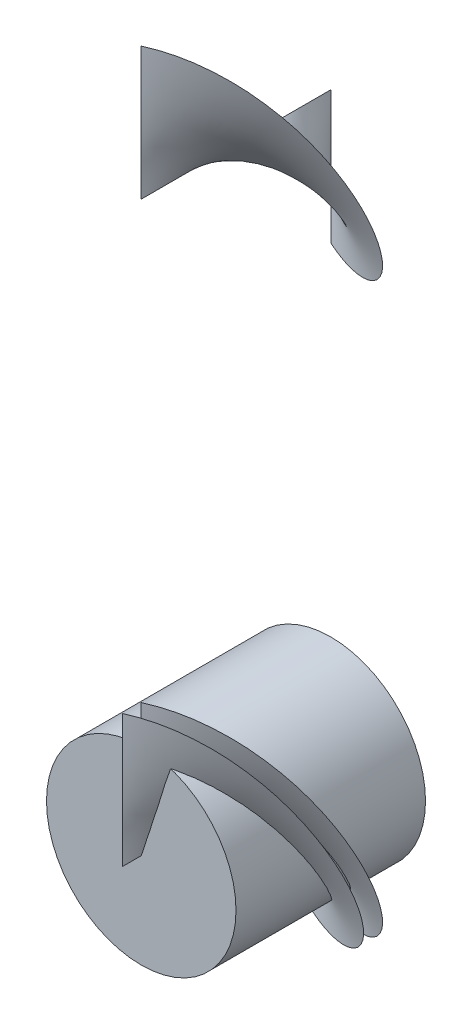
ISO-10303-21;
HEADER;
FILE_DESCRIPTION(('STEP AP214'),'2;1');
FILE_NAME('part.step','',(''),(''),'','','');
FILE_SCHEMA(('AUTOMOTIVE_DESIGN { 1 0 10303 214 1 1 1 1 }'));
ENDSEC;
DATA;
#1=APPLICATION_CONTEXT('core data for automotive mechanical design processes');
#2=APPLICATION_PROTOCOL_DEFINITION('international standard','automotive_design',2000,#1);
#3=PRODUCT_CONTEXT('',#1,'mechanical');
#4=PRODUCT('Part','Part','',(#3));
#5=PRODUCT_RELATED_PRODUCT_CATEGORY('part','',(#4));
#6=PRODUCT_DEFINITION_FORMATION('','',#4);
#7=PRODUCT_DEFINITION_CONTEXT('part definition',#1,'design');
#8=PRODUCT_DEFINITION('design','',#6,#7);
#9=PRODUCT_DEFINITION_SHAPE('','',#8);
#10=(LENGTH_UNIT() NAMED_UNIT(*) SI_UNIT(.MILLI.,.METRE.));
#11=(NAMED_UNIT(*) PLANE_ANGLE_UNIT() SI_UNIT($,.RADIAN.));
#12=(NAMED_UNIT(*) SI_UNIT($,.STERADIAN.) SOLID_ANGLE_UNIT());
#13=UNCERTAINTY_MEASURE_WITH_UNIT(LENGTH_MEASURE(1.E-05),#10,'distance_accuracy_value','');
#14=(GEOMETRIC_REPRESENTATION_CONTEXT(3) GLOBAL_UNCERTAINTY_ASSIGNED_CONTEXT((#13)) GLOBAL_UNIT_ASSIGNED_CONTEXT((#10,
#11,#12)) REPRESENTATION_CONTEXT('',''));
#15=CARTESIAN_POINT('',(0.,0.,0.));
#16=DIRECTION('',(0.,0.,1.));
#17=DIRECTION('',(1.,0.,0.));
#18=AXIS2_PLACEMENT_3D('',#15,#16,#17);
#19=CARTESIAN_POINT('',(0.,0.,10.));
#20=CARTESIAN_POINT('',(0.,0.,15.));
#21=CARTESIAN_POINT('',(0.,0.,20.));
#22=CARTESIAN_POINT('',(0.,0.,25.));
#23=CARTESIAN_POINT('',(0.,0.,30.));
#24=CARTESIAN_POINT('',(0.,0.,35.));
#25=CARTESIAN_POINT('',(0.,0.,39.9999999999999));
#26=CARTESIAN_POINT('',(0.,0.,44.9999999999999));
#27=CARTESIAN_POINT('',(0.,0.,49.9999999999999));
#28=CARTESIAN_POINT('',(0.,0.,54.9999999999999));
#29=CARTESIAN_POINT('',(0.,0.,59.9999999999999));
#30=CARTESIAN_POINT('',(0.,0.,64.9999999999999));
#31=CARTESIAN_POINT('',(0.,0.,69.9999999999999));
#32=CARTESIAN_POINT('',(0.,0.,74.9999999999998));
#33=CARTESIAN_POINT('',(0.,0.,79.9999999999998));
#34=CARTESIAN_POINT('',(0.,0.,84.9999999999998));
#35=CARTESIAN_POINT('',(0.,0.,89.9999999999998));
#36=CARTESIAN_POINT('',(0.,0.,94.9999999999998));
#37=CARTESIAN_POINT('',(0.,0.,99.9999999999998));
#38=CARTESIAN_POINT('',(0.,0.,105.));
#39=CARTESIAN_POINT('',(0.,0.,110.));
#40=CARTESIAN_POINT('',(-4.88807387438039E-13,-70.,10.));
#41=CARTESIAN_POINT('',(11.0869108227171,-70.0000000000001,15.));
#42=CARTESIAN_POINT('',(21.6311896062459,-66.5739561406609,20.));
#43=CARTESIAN_POINT('',(32.1754683897747,-63.1479122813217,25.));
#44=CARTESIAN_POINT('',(41.1449676604727,-56.6311896062466,30.));
#45=CARTESIAN_POINT('',(50.1144669311708,-50.1144669311715,35.));
#46=CARTESIAN_POINT('',(56.631189606246,-41.1449676604735,39.9999999999999));
#47=CARTESIAN_POINT('',(63.1479122813213,-32.1754683897755,44.9999999999999));
#48=CARTESIAN_POINT('',(66.5739561406606,-21.6311896062468,49.9999999999999));
#49=CARTESIAN_POINT('',(69.9999999999999,-11.086910822718,54.9999999999999));
#50=CARTESIAN_POINT('',(70.,-4.93093651235054E-13,59.9999999999999));
#51=CARTESIAN_POINT('',(70.0000000000001,11.086910822717,64.9999999999999));
#52=CARTESIAN_POINT('',(66.5739561406609,21.6311896062459,69.9999999999999));
#53=CARTESIAN_POINT('',(63.1479122813217,32.1754683897747,74.9999999999998));
#54=CARTESIAN_POINT('',(56.6311896062466,41.1449676604727,79.9999999999998));
#55=CARTESIAN_POINT('',(50.1144669311715,50.1144669311708,84.9999999999998));
#56=CARTESIAN_POINT('',(41.1449676604735,56.631189606246,89.9999999999998));
#57=CARTESIAN_POINT('',(32.1754683897756,63.1479122813213,94.9999999999998));
#58=CARTESIAN_POINT('',(21.6311896062468,66.5739561406606,99.9999999999998));
#59=CARTESIAN_POINT('',(11.086910822718,69.9999999999999,105.));
#60=CARTESIAN_POINT('',(4.9737991503207E-13,70.,110.));
#61=(BOUNDED_SURFACE() B_SPLINE_SURFACE(1,2,((#19,#20,#21,#22,#23,#24,#25,#26,#27,#28,#29,#30,
#31,#32,#33,#34,#35,#36,#37,#38,#39),(#40,#41,#42,#43,#44,#45,#46,#47,#48,#49,#50,#51,#52,#53,
#54,#55,#56,#57,#58,#59,#60)),.UNSPECIFIED.,.F.,.F.,.F.) B_SPLINE_SURFACE_WITH_KNOTS((2,2),(3,2,
2,2,2,2,2,2,2,2,3),(0.,1.),(0.,0.1,0.2,0.3,0.4,0.5,0.6,0.7,0.8,0.9,1.),
.UNSPECIFIED.) GEOMETRIC_REPRESENTATION_ITEM() RATIONAL_B_SPLINE_SURFACE(((1.,0.987688340595138,
1.,0.987688340595138,1.,0.987688340595138,1.,0.987688340595138,1.,0.987688340595138,1.,
0.987688340595138,1.,0.987688340595138,1.,0.987688340595138,1.,0.987688340595138,1.,
0.987688340595138,1.),(1.,0.987688340595138,1.,0.987688340595138,1.,0.987688340595138,1.,
0.987688340595138,1.,0.987688340595138,1.,0.987688340595138,1.,0.987688340595138,1.,
0.987688340595138,1.,0.987688340595138,1.,0.987688340595138,1.))) REPRESENTATION_ITEM('') SURFACE());
#62=CARTESIAN_POINT('',(-4.88807387438039E-13,-70.,10.));
#63=CARTESIAN_POINT('',(11.0869108227171,-70.0000000000001,15.));
#64=CARTESIAN_POINT('',(21.6311896062459,-66.5739561406609,20.));
#65=CARTESIAN_POINT('',(32.1754683897747,-63.1479122813217,25.));
#66=CARTESIAN_POINT('',(41.1449676604727,-56.6311896062466,30.));
#67=CARTESIAN_POINT('',(50.1144669311708,-50.1144669311715,35.));
#68=CARTESIAN_POINT('',(56.631189606246,-41.1449676604735,39.9999999999999));
#69=CARTESIAN_POINT('',(63.1479122813213,-32.1754683897755,44.9999999999999));
#70=CARTESIAN_POINT('',(66.5739561406606,-21.6311896062468,49.9999999999999));
#71=CARTESIAN_POINT('',(69.9999999999999,-11.086910822718,54.9999999999999));
#72=CARTESIAN_POINT('',(70.,-4.93093651235054E-13,59.9999999999999));
#73=CARTESIAN_POINT('',(70.0000000000001,11.086910822717,64.9999999999999));
#74=CARTESIAN_POINT('',(66.5739561406609,21.6311896062459,69.9999999999999));
#75=CARTESIAN_POINT('',(63.1479122813217,32.1754683897747,74.9999999999998));
#76=CARTESIAN_POINT('',(56.6311896062466,41.1449676604727,79.9999999999998));
#77=CARTESIAN_POINT('',(50.1144669311715,50.1144669311708,84.9999999999998));
#78=CARTESIAN_POINT('',(41.1449676604735,56.631189606246,89.9999999999998));
#79=CARTESIAN_POINT('',(32.1754683897756,63.1479122813213,94.9999999999998));
#80=CARTESIAN_POINT('',(21.6311896062468,66.5739561406606,99.9999999999998));
#81=CARTESIAN_POINT('',(11.086910822718,69.9999999999999,105.));
#82=CARTESIAN_POINT('',(4.9737991503207E-13,70.,110.));
#83=(BOUNDED_CURVE() B_SPLINE_CURVE(2,(#62,#63,#64,#65,#66,#67,#68,#69,#70,#71,#72,#73,#74,#75,
#76,#77,#78,#79,#80,#81,#82),.UNSPECIFIED.,.F.,.F.) B_SPLINE_CURVE_WITH_KNOTS((3,2,2,2,2,2,2,2,
2,2,3),(0.,0.1,0.2,0.3,0.4,0.5,0.6,0.7,0.8,0.9,1.),
.UNSPECIFIED.) CURVE() GEOMETRIC_REPRESENTATION_ITEM() RATIONAL_B_SPLINE_CURVE((1.,
0.987688340595138,1.,0.987688340595138,1.,0.987688340595138,1.,0.987688340595138,1.,
0.987688340595138,1.,0.987688340595138,1.,0.987688340595138,1.,0.987688340595138,1.,
0.987688340595138,1.,0.987688340595138,1.)) REPRESENTATION_ITEM(''));
#84=CARTESIAN_POINT('',(-4.88807387438039E-13,-70.,10.));
#85=VERTEX_POINT('',#84);
#86=CARTESIAN_POINT('',(4.9737991503207E-13,70.,110.));
#87=VERTEX_POINT('',#86);
#88=EDGE_CURVE('E12',#85,#87,#83,.T.);
#89=DIRECTION('',(0.,1.,0.));
#90=VECTOR('',#89,1.);
#91=CARTESIAN_POINT('',(0.,0.,110.));
#92=LINE('',#91,#90);
#93=CARTESIAN_POINT('',(0.,0.,110.));
#94=VERTEX_POINT('',#93);
#95=EDGE_CURVE('E68',#94,#87,#92,.T.);
#96=DIRECTION('',(0.,0.,1.));
#97=VECTOR('',#96,1.);
#98=CARTESIAN_POINT('',(0.,0.,10.));
#99=LINE('',#98,#97);
#100=CARTESIAN_POINT('',(0.,0.,10.));
#101=VERTEX_POINT('',#100);
#102=EDGE_CURVE('E63',#101,#94,#99,.T.);
#103=DIRECTION('',(0.,-1.,0.));
#104=VECTOR('',#103,1.);
#105=CARTESIAN_POINT('',(0.,0.,10.));
#106=LINE('',#105,#104);
#107=EDGE_CURVE('E81',#101,#85,#106,.T.);
#108=ORIENTED_EDGE('',*,*,#88,.T.);
#109=ORIENTED_EDGE('',*,*,#95,.F.);
#110=ORIENTED_EDGE('',*,*,#102,.F.);
#111=ORIENTED_EDGE('',*,*,#107,.T.);
#112=EDGE_LOOP('',(#108,#109,#110,#111));
#113=FACE_BOUND('',#112,.T.);
#114=ADVANCED_FACE('F60',(#113),#61,.T.);
#115=OPEN_SHELL('',(#114));
#116=SHELL_BASED_SURFACE_MODEL('B2',(#115));
#117=CARTESIAN_POINT('',(0.,300.,0.));
#118=CARTESIAN_POINT('',(0.,300.,4.99999999999999));
#119=CARTESIAN_POINT('',(0.,300.,9.99999999999998));
#120=CARTESIAN_POINT('',(0.,300.,15.));
#121=CARTESIAN_POINT('',(0.,300.,20.));
#122=CARTESIAN_POINT('',(0.,300.,24.9999999999999));
#123=CARTESIAN_POINT('',(0.,300.,29.9999999999999));
#124=CARTESIAN_POINT('',(0.,300.,34.9999999999999));
#125=CARTESIAN_POINT('',(0.,300.,39.9999999999999));
#126=CARTESIAN_POINT('',(0.,300.,44.9999999999999));
#127=CARTESIAN_POINT('',(0.,300.,49.9999999999999));
#128=CARTESIAN_POINT('',(0.,300.,54.9999999999999));
#129=CARTESIAN_POINT('',(0.,300.,59.9999999999999));
#130=CARTESIAN_POINT('',(0.,300.,64.9999999999998));
#131=CARTESIAN_POINT('',(0.,300.,69.9999999999998));
#132=CARTESIAN_POINT('',(0.,300.,74.9999999999998));
#133=CARTESIAN_POINT('',(0.,300.,79.9999999999998));
#134=CARTESIAN_POINT('',(0.,300.,84.9999999999998));
#135=CARTESIAN_POINT('',(0.,300.,89.9999999999998));
#136=CARTESIAN_POINT('',(0.,300.,94.9999999999998));
#137=CARTESIAN_POINT('',(0.,300.,99.9999999999998));
#138=CARTESIAN_POINT('',(-4.88807387438039E-13,230.,0.));
#139=CARTESIAN_POINT('',(11.0869108227171,230.,4.99999999999999));
#140=CARTESIAN_POINT('',(21.6311896062459,233.426043859339,9.99999999999998));
#141=CARTESIAN_POINT('',(32.1754683897747,236.852087718678,15.));
#142=CARTESIAN_POINT('',(41.1449676604727,243.368810393753,20.));
#143=CARTESIAN_POINT('',(50.1144669311708,249.885533068828,24.9999999999999));
#144=CARTESIAN_POINT('',(56.631189606246,258.855032339526,29.9999999999999));
#145=CARTESIAN_POINT('',(63.1479122813213,267.824531610224,34.9999999999999));
#146=CARTESIAN_POINT('',(66.5739561406606,278.368810393753,39.9999999999999));
#147=CARTESIAN_POINT('',(69.9999999999999,288.913089177282,44.9999999999999));
#148=CARTESIAN_POINT('',(70.,299.999999999999,49.9999999999999));
#149=CARTESIAN_POINT('',(70.0000000000001,311.086910822717,54.9999999999999));
#150=CARTESIAN_POINT('',(66.5739561406609,321.631189606246,59.9999999999999));
#151=CARTESIAN_POINT('',(63.1479122813217,332.175468389775,64.9999999999998));
#152=CARTESIAN_POINT('',(56.6311896062466,341.144967660473,69.9999999999998));
#153=CARTESIAN_POINT('',(50.1144669311715,350.114466931171,74.9999999999998));
#154=CARTESIAN_POINT('',(41.1449676604735,356.631189606246,79.9999999999998));
#155=CARTESIAN_POINT('',(32.1754683897756,363.147912281321,84.9999999999998));
#156=CARTESIAN_POINT('',(21.6311896062468,366.573956140661,89.9999999999998));
#157=CARTESIAN_POINT('',(11.086910822718,370.,94.9999999999998));
#158=CARTESIAN_POINT('',(4.9737991503207E-13,370.,99.9999999999998));
#159=(BOUNDED_SURFACE() B_SPLINE_SURFACE(1,2,((#117,#118,#119,#120,#121,#122,#123,#124,#125,
#126,#127,#128,#129,#130,#131,#132,#133,#134,#135,#136,#137),(#138,#139,#140,#141,#142,#143,
#144,#145,#146,#147,#148,#149,#150,#151,#152,#153,#154,#155,#156,#157,#158)),.UNSPECIFIED.,.F.,
.F.,.F.) B_SPLINE_SURFACE_WITH_KNOTS((2,2),(3,2,2,2,2,2,2,2,2,2,3),(0.,1.),(0.,0.1,0.2,0.3,0.4,
0.5,0.6,0.7,0.8,0.9,1.),
.UNSPECIFIED.) GEOMETRIC_REPRESENTATION_ITEM() RATIONAL_B_SPLINE_SURFACE(((1.,0.987688340595138,
1.,0.987688340595138,1.,0.987688340595138,1.,0.987688340595138,1.,0.987688340595138,1.,
0.987688340595138,1.,0.987688340595138,1.,0.987688340595138,1.,0.987688340595138,1.,
0.987688340595138,1.),(1.,0.987688340595138,1.,0.987688340595138,1.,0.987688340595138,1.,
0.987688340595138,1.,0.987688340595138,1.,0.987688340595138,1.,0.987688340595138,1.,
0.987688340595138,1.,0.987688340595138,1.,0.987688340595138,1.))) REPRESENTATION_ITEM('') SURFACE());
#160=CARTESIAN_POINT('',(-4.88807387438039E-13,230.,0.));
#161=CARTESIAN_POINT('',(11.0869108227171,230.,4.99999999999999));
#162=CARTESIAN_POINT('',(21.6311896062459,233.426043859339,9.99999999999998));
#163=CARTESIAN_POINT('',(32.1754683897747,236.852087718678,15.));
#164=CARTESIAN_POINT('',(41.1449676604727,243.368810393753,20.));
#165=CARTESIAN_POINT('',(50.1144669311708,249.885533068828,24.9999999999999));
#166=CARTESIAN_POINT('',(56.631189606246,258.855032339526,29.9999999999999));
#167=CARTESIAN_POINT('',(63.1479122813213,267.824531610224,34.9999999999999));
#168=CARTESIAN_POINT('',(66.5739561406606,278.368810393753,39.9999999999999));
#169=CARTESIAN_POINT('',(69.9999999999999,288.913089177282,44.9999999999999));
#170=CARTESIAN_POINT('',(70.,299.999999999999,49.9999999999999));
#171=CARTESIAN_POINT('',(70.0000000000001,311.086910822717,54.9999999999999));
#172=CARTESIAN_POINT('',(66.5739561406609,321.631189606246,59.9999999999999));
#173=CARTESIAN_POINT('',(63.1479122813217,332.175468389775,64.9999999999998));
#174=CARTESIAN_POINT('',(56.6311896062466,341.144967660473,69.9999999999998));
#175=CARTESIAN_POINT('',(50.1144669311715,350.114466931171,74.9999999999998));
#176=CARTESIAN_POINT('',(41.1449676604735,356.631189606246,79.9999999999998));
#177=CARTESIAN_POINT('',(32.1754683897756,363.147912281321,84.9999999999998));
#178=CARTESIAN_POINT('',(21.6311896062468,366.573956140661,89.9999999999998));
#179=CARTESIAN_POINT('',(11.086910822718,370.,94.9999999999998));
#180=CARTESIAN_POINT('',(4.9737991503207E-13,370.,99.9999999999998));
#181=(BOUNDED_CURVE() B_SPLINE_CURVE(2,(#160,#161,#162,#163,#164,#165,#166,#167,#168,#169,#170,
#171,#172,#173,#174,#175,#176,#177,#178,#179,#180),.UNSPECIFIED.,.F.,
.F.) B_SPLINE_CURVE_WITH_KNOTS((3,2,2,2,2,2,2,2,2,2,3),(0.,0.1,0.2,0.3,0.4,0.5,0.6,0.7,0.8,0.9,
1.),.UNSPECIFIED.) CURVE() GEOMETRIC_REPRESENTATION_ITEM() RATIONAL_B_SPLINE_CURVE((1.,
0.987688340595138,1.,0.987688340595138,1.,0.987688340595138,1.,0.987688340595138,1.,
0.987688340595138,1.,0.987688340595138,1.,0.987688340595138,1.,0.987688340595138,1.,
0.987688340595138,1.,0.987688340595138,1.)) REPRESENTATION_ITEM(''));
#182=CARTESIAN_POINT('',(-4.88807387438039E-13,230.,0.));
#183=VERTEX_POINT('',#182);
#184=CARTESIAN_POINT('',(4.9737991503207E-13,370.,99.9999999999998));
#185=VERTEX_POINT('',#184);
#186=EDGE_CURVE('E58',#183,#185,#181,.T.);
#187=DIRECTION('',(0.,1.,0.));
#188=VECTOR('',#187,1.);
#189=CARTESIAN_POINT('',(0.,300.,100.));
#190=LINE('',#189,#188);
#191=CARTESIAN_POINT('',(0.,300.,100.));
#192=VERTEX_POINT('',#191);
#193=EDGE_CURVE('E135',#192,#185,#190,.T.);
#194=DIRECTION('',(0.,0.,1.));
#195=VECTOR('',#194,1.);
#196=CARTESIAN_POINT('',(0.,300.,0.));
#197=LINE('',#196,#195);
#198=CARTESIAN_POINT('',(0.,300.,0.));
#199=VERTEX_POINT('',#198);
#200=EDGE_CURVE('E130',#199,#192,#197,.T.);
#201=DIRECTION('',(0.,-1.,0.));
#202=VECTOR('',#201,1.);
#203=CARTESIAN_POINT('',(0.,300.,0.));
#204=LINE('',#203,#202);
#205=EDGE_CURVE('E148',#199,#183,#204,.T.);
#206=ORIENTED_EDGE('',*,*,#186,.T.);
#207=ORIENTED_EDGE('',*,*,#193,.F.);
#208=ORIENTED_EDGE('',*,*,#200,.F.);
#209=ORIENTED_EDGE('',*,*,#205,.T.);
#210=EDGE_LOOP('',(#206,#207,#208,#209));
#211=FACE_BOUND('',#210,.T.);
#212=ADVANCED_FACE('F127',(#211),#159,.T.);
#213=OPEN_SHELL('',(#212));
#214=SHELL_BASED_SURFACE_MODEL('B6',(#213));
#215=CARTESIAN_POINT('',(0.,0.,0.));
#216=CARTESIAN_POINT('',(0.,0.,4.99999999999999));
#217=CARTESIAN_POINT('',(0.,0.,9.99999999999998));
#218=CARTESIAN_POINT('',(0.,0.,15.));
#219=CARTESIAN_POINT('',(0.,0.,20.));
#220=CARTESIAN_POINT('',(0.,0.,24.9999999999999));
#221=CARTESIAN_POINT('',(0.,0.,29.9999999999999));
#222=CARTESIAN_POINT('',(0.,0.,34.9999999999999));
#223=CARTESIAN_POINT('',(0.,0.,39.9999999999999));
#224=CARTESIAN_POINT('',(0.,0.,44.9999999999999));
#225=CARTESIAN_POINT('',(0.,0.,49.9999999999999));
#226=CARTESIAN_POINT('',(0.,0.,54.9999999999999));
#227=CARTESIAN_POINT('',(0.,0.,59.9999999999999));
#228=CARTESIAN_POINT('',(0.,0.,64.9999999999998));
#229=CARTESIAN_POINT('',(0.,0.,69.9999999999998));
#230=CARTESIAN_POINT('',(0.,0.,74.9999999999998));
#231=CARTESIAN_POINT('',(0.,0.,79.9999999999998));
#232=CARTESIAN_POINT('',(0.,0.,84.9999999999998));
#233=CARTESIAN_POINT('',(0.,0.,89.9999999999998));
#234=CARTESIAN_POINT('',(0.,0.,94.9999999999998));
#235=CARTESIAN_POINT('',(0.,0.,99.9999999999998));
#236=CARTESIAN_POINT('',(-4.88807387438039E-13,-70.,0.));
#237=CARTESIAN_POINT('',(11.0869108227171,-70.0000000000001,4.99999999999999));
#238=CARTESIAN_POINT('',(21.6311896062459,-66.5739561406609,9.99999999999998));
#239=CARTESIAN_POINT('',(32.1754683897747,-63.1479122813217,15.));
#240=CARTESIAN_POINT('',(41.1449676604727,-56.6311896062466,20.));
#241=CARTESIAN_POINT('',(50.1144669311708,-50.1144669311715,24.9999999999999));
#242=CARTESIAN_POINT('',(56.631189606246,-41.1449676604735,29.9999999999999));
#243=CARTESIAN_POINT('',(63.1479122813213,-32.1754683897755,34.9999999999999));
#244=CARTESIAN_POINT('',(66.5739561406606,-21.6311896062468,39.9999999999999));
#245=CARTESIAN_POINT('',(69.9999999999999,-11.086910822718,44.9999999999999));
#246=CARTESIAN_POINT('',(70.,-4.93093651235054E-13,49.9999999999999));
#247=CARTESIAN_POINT('',(70.0000000000001,11.086910822717,54.9999999999999));
#248=CARTESIAN_POINT('',(66.5739561406609,21.6311896062459,59.9999999999999));
#249=CARTESIAN_POINT('',(63.1479122813217,32.1754683897747,64.9999999999998));
#250=CARTESIAN_POINT('',(56.6311896062466,41.1449676604727,69.9999999999998));
#251=CARTESIAN_POINT('',(50.1144669311715,50.1144669311708,74.9999999999998));
#252=CARTESIAN_POINT('',(41.1449676604735,56.631189606246,79.9999999999998));
#253=CARTESIAN_POINT('',(32.1754683897756,63.1479122813213,84.9999999999998));
#254=CARTESIAN_POINT('',(21.6311896062468,66.5739561406606,89.9999999999998));
#255=CARTESIAN_POINT('',(11.086910822718,69.9999999999999,94.9999999999998));
#256=CARTESIAN_POINT('',(4.9737991503207E-13,70.,99.9999999999998));
#257=(BOUNDED_SURFACE() B_SPLINE_SURFACE(1,2,((#215,#216,#217,#218,#219,#220,#221,#222,#223,
#224,#225,#226,#227,#228,#229,#230,#231,#232,#233,#234,#235),(#236,#237,#238,#239,#240,#241,
#242,#243,#244,#245,#246,#247,#248,#249,#250,#251,#252,#253,#254,#255,#256)),.UNSPECIFIED.,.F.,
.F.,.F.) B_SPLINE_SURFACE_WITH_KNOTS((2,2),(3,2,2,2,2,2,2,2,2,2,3),(0.,1.),(0.,0.1,0.2,0.3,0.4,
0.5,0.6,0.7,0.8,0.9,1.),
.UNSPECIFIED.) GEOMETRIC_REPRESENTATION_ITEM() RATIONAL_B_SPLINE_SURFACE(((1.,0.987688340595138,
1.,0.987688340595138,1.,0.987688340595138,1.,0.987688340595138,1.,0.987688340595138,1.,
0.987688340595138,1.,0.987688340595138,1.,0.987688340595138,1.,0.987688340595138,1.,
0.987688340595138,1.),(1.,0.987688340595138,1.,0.987688340595138,1.,0.987688340595138,1.,
0.987688340595138,1.,0.987688340595138,1.,0.987688340595138,1.,0.987688340595138,1.,
0.987688340595138,1.,0.987688340595138,1.,0.987688340595138,1.))) REPRESENTATION_ITEM('') SURFACE());
#258=CARTESIAN_POINT('',(-4.88807387438039E-13,-70.,0.));
#259=CARTESIAN_POINT('',(11.0869108227171,-70.0000000000001,4.99999999999999));
#260=CARTESIAN_POINT('',(21.6311896062459,-66.5739561406609,9.99999999999998));
#261=CARTESIAN_POINT('',(32.1754683897747,-63.1479122813217,15.));
#262=CARTESIAN_POINT('',(41.1449676604727,-56.6311896062466,20.));
#263=CARTESIAN_POINT('',(50.1144669311708,-50.1144669311715,24.9999999999999));
#264=CARTESIAN_POINT('',(56.631189606246,-41.1449676604735,29.9999999999999));
#265=CARTESIAN_POINT('',(63.1479122813213,-32.1754683897755,34.9999999999999));
#266=CARTESIAN_POINT('',(66.5739561406606,-21.6311896062468,39.9999999999999));
#267=CARTESIAN_POINT('',(69.9999999999999,-11.086910822718,44.9999999999999));
#268=CARTESIAN_POINT('',(70.,-4.93093651235054E-13,49.9999999999999));
#269=CARTESIAN_POINT('',(70.0000000000001,11.086910822717,54.9999999999999));
#270=CARTESIAN_POINT('',(66.5739561406609,21.6311896062459,59.9999999999999));
#271=CARTESIAN_POINT('',(63.1479122813217,32.1754683897747,64.9999999999998));
#272=CARTESIAN_POINT('',(56.6311896062466,41.1449676604727,69.9999999999998));
#273=CARTESIAN_POINT('',(50.1144669311715,50.1144669311708,74.9999999999998));
#274=CARTESIAN_POINT('',(41.1449676604735,56.631189606246,79.9999999999998));
#275=CARTESIAN_POINT('',(32.1754683897756,63.1479122813213,84.9999999999998));
#276=CARTESIAN_POINT('',(21.6311896062468,66.5739561406606,89.9999999999998));
#277=CARTESIAN_POINT('',(11.086910822718,69.9999999999999,94.9999999999998));
#278=CARTESIAN_POINT('',(4.9737991503207E-13,70.,99.9999999999998));
#279=(BOUNDED_CURVE() B_SPLINE_CURVE(2,(#258,#259,#260,#261,#262,#263,#264,#265,#266,#267,#268,
#269,#270,#271,#272,#273,#274,#275,#276,#277,#278),.UNSPECIFIED.,.F.,
.F.) B_SPLINE_CURVE_WITH_KNOTS((3,2,2,2,2,2,2,2,2,2,3),(0.,0.1,0.2,0.3,0.4,0.5,0.6,0.7,0.8,0.9,
1.),.UNSPECIFIED.) CURVE() GEOMETRIC_REPRESENTATION_ITEM() RATIONAL_B_SPLINE_CURVE((1.,
0.987688340595138,1.,0.987688340595138,1.,0.987688340595138,1.,0.987688340595138,1.,
0.987688340595138,1.,0.987688340595138,1.,0.987688340595138,1.,0.987688340595138,1.,
0.987688340595138,1.,0.987688340595138,1.)) REPRESENTATION_ITEM(''));
#280=CARTESIAN_POINT('',(-4.88807387438039E-13,-70.,0.));
#281=VERTEX_POINT('',#280);
#282=CARTESIAN_POINT('',(4.9737991503207E-13,70.,99.9999999999998));
#283=VERTEX_POINT('',#282);
#284=EDGE_CURVE('E125',#281,#283,#279,.T.);
#285=DIRECTION('',(0.,1.,0.));
#286=VECTOR('',#285,1.);
#287=CARTESIAN_POINT('',(0.,0.,100.));
#288=LINE('',#287,#286);
#289=CARTESIAN_POINT('',(0.,0.,100.));
#290=VERTEX_POINT('',#289);
#291=EDGE_CURVE('E199',#290,#283,#288,.T.);
#292=DIRECTION('',(0.,0.,1.));
#293=VECTOR('',#292,1.);
#294=CARTESIAN_POINT('',(0.,0.,0.));
#295=LINE('',#294,#293);
#296=CARTESIAN_POINT('',(0.,0.,0.));
#297=VERTEX_POINT('',#296);
#298=EDGE_CURVE('E194',#297,#290,#295,.T.);
#299=DIRECTION('',(0.,-1.,0.));
#300=VECTOR('',#299,1.);
#301=CARTESIAN_POINT('',(0.,0.,0.));
#302=LINE('',#301,#300);
#303=EDGE_CURVE('E212',#297,#281,#302,.T.);
#304=ORIENTED_EDGE('',*,*,#284,.T.);
#305=ORIENTED_EDGE('',*,*,#291,.F.);
#306=ORIENTED_EDGE('',*,*,#298,.F.);
#307=ORIENTED_EDGE('',*,*,#303,.T.);
#308=EDGE_LOOP('',(#304,#305,#306,#307));
#309=FACE_BOUND('',#308,.T.);
#310=ADVANCED_FACE('F191',(#309),#257,.T.);
#311=OPEN_SHELL('',(#310));
#312=SHELL_BASED_SURFACE_MODEL('B52',(#311));
#313=CARTESIAN_POINT('',(0.,0.,100.));
#314=DIRECTION('',(0.,0.,-1.));
#315=DIRECTION('',(-1.,0.,0.));
#316=AXIS2_PLACEMENT_3D('',#313,#314,#315);
#317=CYLINDRICAL_SURFACE('',#316,50.);
#318=CARTESIAN_POINT('',(0.,0.,100.));
#319=DIRECTION('',(0.,0.,1.));
#320=DIRECTION('',(1.,0.,0.));
#321=AXIS2_PLACEMENT_3D('',#318,#319,#320);
#322=CIRCLE('',#321,50.);
#323=CARTESIAN_POINT('',(50.,0.,100.));
#324=VERTEX_POINT('',#323);
#325=EDGE_CURVE('E190',#324,#324,#322,.T.);
#326=ORIENTED_EDGE('',*,*,#325,.F.);
#327=EDGE_LOOP('',(#326));
#328=FACE_BOUND('',#327,.T.);
#329=CARTESIAN_POINT('',(0.,0.,0.));
#330=DIRECTION('',(0.,0.,1.));
#331=DIRECTION('',(1.,0.,0.));
#332=AXIS2_PLACEMENT_3D('',#329,#330,#331);
#333=CIRCLE('',#332,50.);
#334=CARTESIAN_POINT('',(50.,0.,0.));
#335=VERTEX_POINT('',#334);
#336=EDGE_CURVE('E250',#335,#335,#333,.T.);
#337=ORIENTED_EDGE('',*,*,#336,.T.);
#338=EDGE_LOOP('',(#337));
#339=FACE_BOUND('',#338,.T.);
#340=ADVANCED_FACE('F247',(#328,#339),#317,.T.);
#341=CARTESIAN_POINT('',(0.,0.,100.));
#342=DIRECTION('',(0.,0.,1.));
#343=DIRECTION('',(1.,0.,0.));
#344=AXIS2_PLACEMENT_3D('',#341,#342,#343);
#345=PLANE('',#344);
#346=ORIENTED_EDGE('',*,*,#325,.T.);
#347=EDGE_LOOP('',(#346));
#348=FACE_BOUND('',#347,.T.);
#349=ADVANCED_FACE('F264',(#348),#345,.T.);
#350=CARTESIAN_POINT('',(0.,0.,0.));
#351=DIRECTION('',(0.,0.,1.));
#352=DIRECTION('',(1.,0.,0.));
#353=AXIS2_PLACEMENT_3D('',#350,#351,#352);
#354=PLANE('',#353);
#355=ORIENTED_EDGE('',*,*,#336,.F.);
#356=EDGE_LOOP('',(#355));
#357=FACE_BOUND('',#356,.T.);
#358=ADVANCED_FACE('F262',(#357),#354,.F.);
#359=CLOSED_SHELL('',(#340,#349,#358));
#360=MANIFOLD_SOLID_BREP('B119',#359);
#361=ADVANCED_BREP_SHAPE_REPRESENTATION('',(#18,#360),#14);
#362=MANIFOLD_SURFACE_SHAPE_REPRESENTATION('',(#18,#116,#214,#312),#14);
#363=SHAPE_REPRESENTATION('',(#18),#14);
#364=SHAPE_DEFINITION_REPRESENTATION(#9,#363);
#365=SHAPE_REPRESENTATION_RELATIONSHIP('','',#363,#361);
#366=SHAPE_REPRESENTATION_RELATIONSHIP('','',#363,#362);
ENDSEC;
END-ISO-10303-21;
